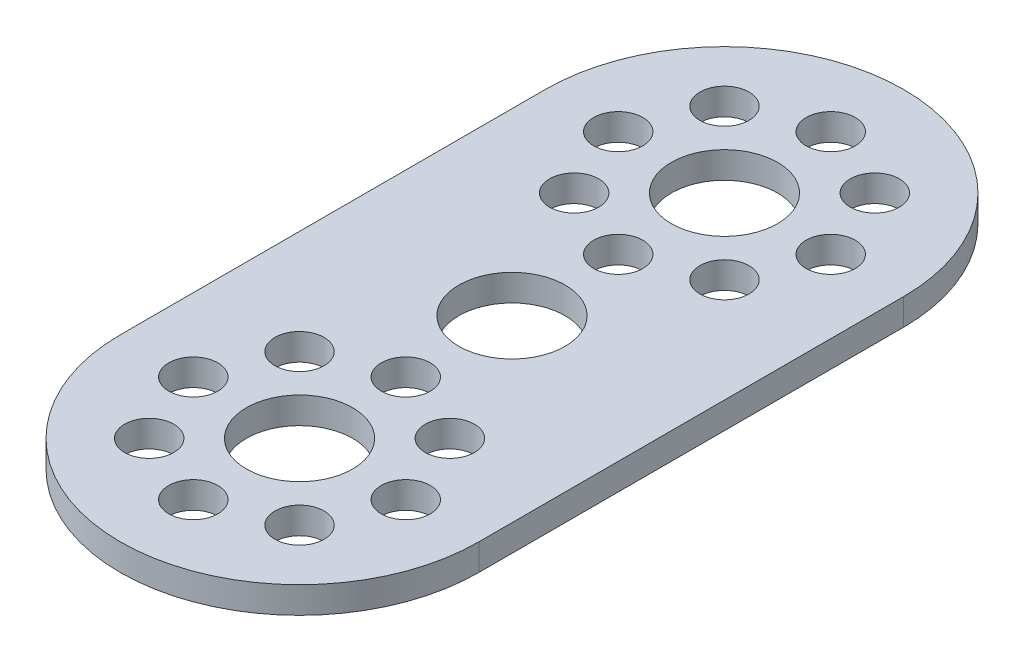
ISO-10303-21;
HEADER;
FILE_DESCRIPTION(('STEP AP214'),'2;1');
FILE_NAME('part.step','',(''),(''),'','','');
FILE_SCHEMA(('AUTOMOTIVE_DESIGN { 1 0 10303 214 1 1 1 1 }'));
ENDSEC;
DATA;
#1=APPLICATION_CONTEXT('core data for automotive mechanical design processes');
#2=APPLICATION_PROTOCOL_DEFINITION('international standard','automotive_design',2000,#1);
#3=PRODUCT_CONTEXT('',#1,'mechanical');
#4=PRODUCT('Part','Part','',(#3));
#5=PRODUCT_RELATED_PRODUCT_CATEGORY('part','',(#4));
#6=PRODUCT_DEFINITION_FORMATION('','',#4);
#7=PRODUCT_DEFINITION_CONTEXT('part definition',#1,'design');
#8=PRODUCT_DEFINITION('design','',#6,#7);
#9=PRODUCT_DEFINITION_SHAPE('','',#8);
#10=(LENGTH_UNIT() NAMED_UNIT(*) SI_UNIT(.MILLI.,.METRE.));
#11=(NAMED_UNIT(*) PLANE_ANGLE_UNIT() SI_UNIT($,.RADIAN.));
#12=(NAMED_UNIT(*) SI_UNIT($,.STERADIAN.) SOLID_ANGLE_UNIT());
#13=UNCERTAINTY_MEASURE_WITH_UNIT(LENGTH_MEASURE(1.E-05),#10,'distance_accuracy_value','');
#14=(GEOMETRIC_REPRESENTATION_CONTEXT(3) GLOBAL_UNCERTAINTY_ASSIGNED_CONTEXT((#13)) GLOBAL_UNIT_ASSIGNED_CONTEXT((#10,
#11,#12)) REPRESENTATION_CONTEXT('',''));
#15=CARTESIAN_POINT('',(0.,0.,0.));
#16=DIRECTION('',(0.,0.,1.));
#17=DIRECTION('',(1.,0.,0.));
#18=AXIS2_PLACEMENT_3D('',#15,#16,#17);
#19=CARTESIAN_POINT('',(0.,2.,16.));
#20=DIRECTION('',(0.,-1.,0.));
#21=DIRECTION('',(0.,0.,-1.));
#22=AXIS2_PLACEMENT_3D('',#19,#20,#21);
#23=CYLINDRICAL_SURFACE('',#22,13.5);
#24=CARTESIAN_POINT('',(0.,0.,16.));
#25=DIRECTION('',(0.,1.,0.));
#26=DIRECTION('',(0.,0.,1.));
#27=AXIS2_PLACEMENT_3D('',#24,#25,#26);
#28=CIRCLE('',#27,13.5);
#29=CARTESIAN_POINT('',(-13.5,0.,16.));
#30=VERTEX_POINT('',#29);
#31=CARTESIAN_POINT('',(13.5,0.,16.));
#32=VERTEX_POINT('',#31);
#33=EDGE_CURVE('E95',#30,#32,#28,.T.);
#34=ORIENTED_EDGE('',*,*,#33,.T.);
#35=DIRECTION('',(0.,-1.,0.));
#36=VECTOR('',#35,1.);
#37=CARTESIAN_POINT('',(13.5,2.,16.));
#38=LINE('',#37,#36);
#39=CARTESIAN_POINT('',(13.5,2.,16.));
#40=VERTEX_POINT('',#39);
#41=EDGE_CURVE('E11',#40,#32,#38,.T.);
#42=ORIENTED_EDGE('',*,*,#41,.F.);
#43=CARTESIAN_POINT('',(0.,2.,16.));
#44=DIRECTION('',(0.,1.,0.));
#45=DIRECTION('',(0.,0.,1.));
#46=AXIS2_PLACEMENT_3D('',#43,#44,#45);
#47=CIRCLE('',#46,13.5);
#48=CARTESIAN_POINT('',(-13.5,2.,16.));
#49=VERTEX_POINT('',#48);
#50=EDGE_CURVE('E83',#49,#40,#47,.T.);
#51=ORIENTED_EDGE('',*,*,#50,.F.);
#52=DIRECTION('',(0.,-1.,0.));
#53=VECTOR('',#52,1.);
#54=CARTESIAN_POINT('',(-13.5,2.,16.));
#55=LINE('',#54,#53);
#56=EDGE_CURVE('E91',#49,#30,#55,.T.);
#57=ORIENTED_EDGE('',*,*,#56,.T.);
#58=EDGE_LOOP('',(#34,#42,#51,#57));
#59=FACE_BOUND('',#58,.T.);
#60=ADVANCED_FACE('F32',(#59),#23,.T.);
#61=CARTESIAN_POINT('',(13.5,2.,-16.));
#62=DIRECTION('',(-1.,0.,0.));
#63=DIRECTION('',(0.,0.,1.));
#64=AXIS2_PLACEMENT_3D('',#61,#62,#63);
#65=PLANE('',#64);
#66=DIRECTION('',(0.,0.,-1.));
#67=VECTOR('',#66,1.);
#68=CARTESIAN_POINT('',(13.5,0.,-16.));
#69=LINE('',#68,#67);
#70=CARTESIAN_POINT('',(13.5,0.,-16.));
#71=VERTEX_POINT('',#70);
#72=EDGE_CURVE('E87',#32,#71,#69,.T.);
#73=ORIENTED_EDGE('',*,*,#72,.T.);
#74=DIRECTION('',(0.,-1.,0.));
#75=VECTOR('',#74,1.);
#76=CARTESIAN_POINT('',(13.5,2.,-16.));
#77=LINE('',#76,#75);
#78=CARTESIAN_POINT('',(13.5,2.,-16.));
#79=VERTEX_POINT('',#78);
#80=EDGE_CURVE('E40',#79,#71,#77,.T.);
#81=ORIENTED_EDGE('',*,*,#80,.F.);
#82=DIRECTION('',(0.,0.,-1.));
#83=VECTOR('',#82,1.);
#84=CARTESIAN_POINT('',(13.5,2.,-16.));
#85=LINE('',#84,#83);
#86=EDGE_CURVE('E78',#40,#79,#85,.T.);
#87=ORIENTED_EDGE('',*,*,#86,.F.);
#88=ORIENTED_EDGE('',*,*,#41,.T.);
#89=EDGE_LOOP('',(#73,#81,#87,#88));
#90=FACE_BOUND('',#89,.T.);
#91=ADVANCED_FACE('F86',(#90),#65,.F.);
#92=CARTESIAN_POINT('',(0.,2.,-16.));
#93=DIRECTION('',(0.,-1.,0.));
#94=DIRECTION('',(0.,0.,-1.));
#95=AXIS2_PLACEMENT_3D('',#92,#93,#94);
#96=CYLINDRICAL_SURFACE('',#95,13.5);
#97=CARTESIAN_POINT('',(0.,0.,-16.));
#98=DIRECTION('',(0.,1.,0.));
#99=DIRECTION('',(0.,0.,1.));
#100=AXIS2_PLACEMENT_3D('',#97,#98,#99);
#101=CIRCLE('',#100,13.5);
#102=CARTESIAN_POINT('',(-13.5,0.,-16.));
#103=VERTEX_POINT('',#102);
#104=EDGE_CURVE('E65',#71,#103,#101,.T.);
#105=ORIENTED_EDGE('',*,*,#104,.T.);
#106=DIRECTION('',(0.,-1.,0.));
#107=VECTOR('',#106,1.);
#108=CARTESIAN_POINT('',(-13.5,2.,-16.));
#109=LINE('',#108,#107);
#110=CARTESIAN_POINT('',(-13.5,2.,-16.));
#111=VERTEX_POINT('',#110);
#112=EDGE_CURVE('E88',#111,#103,#109,.T.);
#113=ORIENTED_EDGE('',*,*,#112,.F.);
#114=CARTESIAN_POINT('',(0.,2.,-16.));
#115=DIRECTION('',(0.,1.,0.));
#116=DIRECTION('',(0.,0.,1.));
#117=AXIS2_PLACEMENT_3D('',#114,#115,#116);
#118=CIRCLE('',#117,13.5);
#119=EDGE_CURVE('E81',#79,#111,#118,.T.);
#120=ORIENTED_EDGE('',*,*,#119,.F.);
#121=ORIENTED_EDGE('',*,*,#80,.T.);
#122=EDGE_LOOP('',(#105,#113,#120,#121));
#123=FACE_BOUND('',#122,.T.);
#124=ADVANCED_FACE('F89',(#123),#96,.T.);
#125=CARTESIAN_POINT('',(-13.5,2.,-16.));
#126=DIRECTION('',(1.,0.,0.));
#127=DIRECTION('',(0.,0.,-1.));
#128=AXIS2_PLACEMENT_3D('',#125,#126,#127);
#129=PLANE('',#128);
#130=DIRECTION('',(0.,0.,1.));
#131=VECTOR('',#130,1.);
#132=CARTESIAN_POINT('',(-13.5,0.,-16.));
#133=LINE('',#132,#131);
#134=EDGE_CURVE('E71',#103,#30,#133,.T.);
#135=ORIENTED_EDGE('',*,*,#134,.T.);
#136=ORIENTED_EDGE('',*,*,#56,.F.);
#137=DIRECTION('',(0.,0.,1.));
#138=VECTOR('',#137,1.);
#139=CARTESIAN_POINT('',(-13.5,2.,-16.));
#140=LINE('',#139,#138);
#141=EDGE_CURVE('E48',#111,#49,#140,.T.);
#142=ORIENTED_EDGE('',*,*,#141,.F.);
#143=ORIENTED_EDGE('',*,*,#112,.T.);
#144=EDGE_LOOP('',(#135,#136,#142,#143));
#145=FACE_BOUND('',#144,.T.);
#146=ADVANCED_FACE('F103',(#145),#129,.F.);
#147=CARTESIAN_POINT('',(0.,2.,16.));
#148=DIRECTION('',(0.,1.,0.));
#149=DIRECTION('',(0.,0.,1.));
#150=AXIS2_PLACEMENT_3D('',#147,#148,#149);
#151=PLANE('',#150);
#152=CARTESIAN_POINT('',(-5.66,2.,-10.34));
#153=DIRECTION('',(0.,1.,0.));
#154=DIRECTION('',(0.,0.,1.));
#155=AXIS2_PLACEMENT_3D('',#152,#153,#154);
#156=CIRCLE('',#155,1.84999999999998);
#157=CARTESIAN_POINT('',(-5.66,2.,-8.49000000000002));
#158=VERTEX_POINT('',#157);
#159=EDGE_CURVE('E217',#158,#158,#156,.T.);
#160=ORIENTED_EDGE('',*,*,#159,.F.);
#161=EDGE_LOOP('',(#160));
#162=FACE_BOUND('',#161,.T.);
#163=CARTESIAN_POINT('',(5.66,2.,-10.34));
#164=DIRECTION('',(0.,1.,0.));
#165=DIRECTION('',(0.,0.,1.));
#166=AXIS2_PLACEMENT_3D('',#163,#164,#165);
#167=CIRCLE('',#166,1.84999999999998);
#168=CARTESIAN_POINT('',(5.66,2.,-8.49000000000002));
#169=VERTEX_POINT('',#168);
#170=EDGE_CURVE('E211',#169,#169,#167,.T.);
#171=ORIENTED_EDGE('',*,*,#170,.F.);
#172=EDGE_LOOP('',(#171));
#173=FACE_BOUND('',#172,.T.);
#174=CARTESIAN_POINT('',(5.66,2.,-21.66));
#175=DIRECTION('',(0.,1.,0.));
#176=DIRECTION('',(0.,0.,1.));
#177=AXIS2_PLACEMENT_3D('',#174,#175,#176);
#178=CIRCLE('',#177,1.84999999999998);
#179=CARTESIAN_POINT('',(5.66,2.,-19.81));
#180=VERTEX_POINT('',#179);
#181=EDGE_CURVE('E205',#180,#180,#178,.T.);
#182=ORIENTED_EDGE('',*,*,#181,.F.);
#183=EDGE_LOOP('',(#182));
#184=FACE_BOUND('',#183,.T.);
#185=CARTESIAN_POINT('',(-5.66,2.,-21.66));
#186=DIRECTION('',(0.,1.,0.));
#187=DIRECTION('',(0.,0.,1.));
#188=AXIS2_PLACEMENT_3D('',#185,#186,#187);
#189=CIRCLE('',#188,1.84999999999998);
#190=CARTESIAN_POINT('',(-5.66,2.,-19.81));
#191=VERTEX_POINT('',#190);
#192=EDGE_CURVE('E199',#191,#191,#189,.T.);
#193=ORIENTED_EDGE('',*,*,#192,.F.);
#194=EDGE_LOOP('',(#193));
#195=FACE_BOUND('',#194,.T.);
#196=CARTESIAN_POINT('',(0.,2.,-24.));
#197=DIRECTION('',(0.,1.,0.));
#198=DIRECTION('',(0.,0.,1.));
#199=AXIS2_PLACEMENT_3D('',#196,#197,#198);
#200=CIRCLE('',#199,1.84999999999998);
#201=CARTESIAN_POINT('',(0.,2.,-22.15));
#202=VERTEX_POINT('',#201);
#203=EDGE_CURVE('E193',#202,#202,#200,.T.);
#204=ORIENTED_EDGE('',*,*,#203,.F.);
#205=EDGE_LOOP('',(#204));
#206=FACE_BOUND('',#205,.T.);
#207=CARTESIAN_POINT('',(0.,2.,-8.));
#208=DIRECTION('',(0.,1.,0.));
#209=DIRECTION('',(0.,0.,1.));
#210=AXIS2_PLACEMENT_3D('',#207,#208,#209);
#211=CIRCLE('',#210,1.84999999999998);
#212=CARTESIAN_POINT('',(0.,2.,-6.15000000000002));
#213=VERTEX_POINT('',#212);
#214=EDGE_CURVE('E187',#213,#213,#211,.T.);
#215=ORIENTED_EDGE('',*,*,#214,.F.);
#216=EDGE_LOOP('',(#215));
#217=FACE_BOUND('',#216,.T.);
#218=CARTESIAN_POINT('',(-8.00000000000001,2.,-16.));
#219=DIRECTION('',(0.,1.,0.));
#220=DIRECTION('',(0.,0.,1.));
#221=AXIS2_PLACEMENT_3D('',#218,#219,#220);
#222=CIRCLE('',#221,1.84999999999998);
#223=CARTESIAN_POINT('',(-8.00000000000001,2.,-14.15));
#224=VERTEX_POINT('',#223);
#225=EDGE_CURVE('E181',#224,#224,#222,.T.);
#226=ORIENTED_EDGE('',*,*,#225,.F.);
#227=EDGE_LOOP('',(#226));
#228=FACE_BOUND('',#227,.T.);
#229=CARTESIAN_POINT('',(8.00000000000001,2.,-16.));
#230=DIRECTION('',(0.,1.,0.));
#231=DIRECTION('',(0.,0.,1.));
#232=AXIS2_PLACEMENT_3D('',#229,#230,#231);
#233=CIRCLE('',#232,1.84999999999998);
#234=CARTESIAN_POINT('',(8.00000000000001,2.,-14.15));
#235=VERTEX_POINT('',#234);
#236=EDGE_CURVE('E175',#235,#235,#233,.T.);
#237=ORIENTED_EDGE('',*,*,#236,.F.);
#238=EDGE_LOOP('',(#237));
#239=FACE_BOUND('',#238,.T.);
#240=CARTESIAN_POINT('',(0.,2.,-16.));
#241=DIRECTION('',(0.,1.,0.));
#242=DIRECTION('',(0.,0.,1.));
#243=AXIS2_PLACEMENT_3D('',#240,#241,#242);
#244=CIRCLE('',#243,3.99999999999999);
#245=CARTESIAN_POINT('',(0.,2.,-12.));
#246=VERTEX_POINT('',#245);
#247=EDGE_CURVE('E169',#246,#246,#244,.T.);
#248=ORIENTED_EDGE('',*,*,#247,.F.);
#249=EDGE_LOOP('',(#248));
#250=FACE_BOUND('',#249,.T.);
#251=CARTESIAN_POINT('',(-5.66,2.,21.66));
#252=DIRECTION('',(0.,1.,0.));
#253=DIRECTION('',(0.,0.,1.));
#254=AXIS2_PLACEMENT_3D('',#251,#252,#253);
#255=CIRCLE('',#254,1.84999999999998);
#256=CARTESIAN_POINT('',(-5.66,2.,23.51));
#257=VERTEX_POINT('',#256);
#258=EDGE_CURVE('E163',#257,#257,#255,.T.);
#259=ORIENTED_EDGE('',*,*,#258,.F.);
#260=EDGE_LOOP('',(#259));
#261=FACE_BOUND('',#260,.T.);
#262=CARTESIAN_POINT('',(5.66,2.,21.66));
#263=DIRECTION('',(0.,1.,0.));
#264=DIRECTION('',(0.,0.,1.));
#265=AXIS2_PLACEMENT_3D('',#262,#263,#264);
#266=CIRCLE('',#265,1.84999999999998);
#267=CARTESIAN_POINT('',(5.66,2.,23.51));
#268=VERTEX_POINT('',#267);
#269=EDGE_CURVE('E157',#268,#268,#266,.T.);
#270=ORIENTED_EDGE('',*,*,#269,.F.);
#271=EDGE_LOOP('',(#270));
#272=FACE_BOUND('',#271,.T.);
#273=CARTESIAN_POINT('',(5.66,2.,10.34));
#274=DIRECTION('',(0.,1.,0.));
#275=DIRECTION('',(0.,0.,1.));
#276=AXIS2_PLACEMENT_3D('',#273,#274,#275);
#277=CIRCLE('',#276,1.84999999999998);
#278=CARTESIAN_POINT('',(5.66,2.,12.19));
#279=VERTEX_POINT('',#278);
#280=EDGE_CURVE('E151',#279,#279,#277,.T.);
#281=ORIENTED_EDGE('',*,*,#280,.F.);
#282=EDGE_LOOP('',(#281));
#283=FACE_BOUND('',#282,.T.);
#284=CARTESIAN_POINT('',(-5.66,2.,10.34));
#285=DIRECTION('',(0.,1.,0.));
#286=DIRECTION('',(0.,0.,1.));
#287=AXIS2_PLACEMENT_3D('',#284,#285,#286);
#288=CIRCLE('',#287,1.84999999999998);
#289=CARTESIAN_POINT('',(-5.66,2.,12.19));
#290=VERTEX_POINT('',#289);
#291=EDGE_CURVE('E145',#290,#290,#288,.T.);
#292=ORIENTED_EDGE('',*,*,#291,.F.);
#293=EDGE_LOOP('',(#292));
#294=FACE_BOUND('',#293,.T.);
#295=CARTESIAN_POINT('',(0.,2.,8.));
#296=DIRECTION('',(0.,1.,0.));
#297=DIRECTION('',(0.,0.,1.));
#298=AXIS2_PLACEMENT_3D('',#295,#296,#297);
#299=CIRCLE('',#298,1.84999999999998);
#300=CARTESIAN_POINT('',(0.,2.,9.84999999999998));
#301=VERTEX_POINT('',#300);
#302=EDGE_CURVE('E139',#301,#301,#299,.T.);
#303=ORIENTED_EDGE('',*,*,#302,.F.);
#304=EDGE_LOOP('',(#303));
#305=FACE_BOUND('',#304,.T.);
#306=CARTESIAN_POINT('',(0.,2.,24.));
#307=DIRECTION('',(0.,1.,0.));
#308=DIRECTION('',(0.,0.,1.));
#309=AXIS2_PLACEMENT_3D('',#306,#307,#308);
#310=CIRCLE('',#309,1.84999999999998);
#311=CARTESIAN_POINT('',(0.,2.,25.85));
#312=VERTEX_POINT('',#311);
#313=EDGE_CURVE('E133',#312,#312,#310,.T.);
#314=ORIENTED_EDGE('',*,*,#313,.F.);
#315=EDGE_LOOP('',(#314));
#316=FACE_BOUND('',#315,.T.);
#317=CARTESIAN_POINT('',(-8.00000000000001,2.,16.));
#318=DIRECTION('',(0.,1.,0.));
#319=DIRECTION('',(0.,0.,1.));
#320=AXIS2_PLACEMENT_3D('',#317,#318,#319);
#321=CIRCLE('',#320,1.84999999999998);
#322=CARTESIAN_POINT('',(-8.00000000000001,2.,17.85));
#323=VERTEX_POINT('',#322);
#324=EDGE_CURVE('E127',#323,#323,#321,.T.);
#325=ORIENTED_EDGE('',*,*,#324,.F.);
#326=EDGE_LOOP('',(#325));
#327=FACE_BOUND('',#326,.T.);
#328=CARTESIAN_POINT('',(8.00000000000001,2.,16.));
#329=DIRECTION('',(0.,1.,0.));
#330=DIRECTION('',(0.,0.,1.));
#331=AXIS2_PLACEMENT_3D('',#328,#329,#330);
#332=CIRCLE('',#331,1.84999999999998);
#333=CARTESIAN_POINT('',(8.00000000000001,2.,17.85));
#334=VERTEX_POINT('',#333);
#335=EDGE_CURVE('E121',#334,#334,#332,.T.);
#336=ORIENTED_EDGE('',*,*,#335,.F.);
#337=EDGE_LOOP('',(#336));
#338=FACE_BOUND('',#337,.T.);
#339=CARTESIAN_POINT('',(0.,2.,16.));
#340=DIRECTION('',(0.,1.,0.));
#341=DIRECTION('',(0.,0.,1.));
#342=AXIS2_PLACEMENT_3D('',#339,#340,#341);
#343=CIRCLE('',#342,3.99999999999999);
#344=CARTESIAN_POINT('',(0.,2.,20.));
#345=VERTEX_POINT('',#344);
#346=EDGE_CURVE('E115',#345,#345,#343,.T.);
#347=ORIENTED_EDGE('',*,*,#346,.F.);
#348=EDGE_LOOP('',(#347));
#349=FACE_BOUND('',#348,.T.);
#350=CARTESIAN_POINT('',(0.,2.,0.));
#351=DIRECTION('',(0.,1.,0.));
#352=DIRECTION('',(0.,0.,1.));
#353=AXIS2_PLACEMENT_3D('',#350,#351,#352);
#354=CIRCLE('',#353,4.);
#355=CARTESIAN_POINT('',(0.,2.,4.));
#356=VERTEX_POINT('',#355);
#357=EDGE_CURVE('E109',#356,#356,#354,.T.);
#358=ORIENTED_EDGE('',*,*,#357,.F.);
#359=EDGE_LOOP('',(#358));
#360=FACE_BOUND('',#359,.T.);
#361=ORIENTED_EDGE('',*,*,#50,.T.);
#362=ORIENTED_EDGE('',*,*,#86,.T.);
#363=ORIENTED_EDGE('',*,*,#119,.T.);
#364=ORIENTED_EDGE('',*,*,#141,.T.);
#365=EDGE_LOOP('',(#361,#362,#363,#364));
#366=FACE_BOUND('',#365,.T.);
#367=ADVANCED_FACE('F79',(#162,#173,#184,#195,#206,#217,#228,#239,#250,#261,#272,#283,#294,#305,
#316,#327,#338,#349,#360,#366),#151,.T.);
#368=CARTESIAN_POINT('',(0.,0.,16.));
#369=DIRECTION('',(0.,1.,0.));
#370=DIRECTION('',(0.,0.,1.));
#371=AXIS2_PLACEMENT_3D('',#368,#369,#370);
#372=PLANE('',#371);
#373=CARTESIAN_POINT('',(-5.66,0.,-10.34));
#374=DIRECTION('',(0.,1.,0.));
#375=DIRECTION('',(0.,0.,1.));
#376=AXIS2_PLACEMENT_3D('',#373,#374,#375);
#377=CIRCLE('',#376,1.84999999999998);
#378=CARTESIAN_POINT('',(-5.66,0.,-8.49000000000002));
#379=VERTEX_POINT('',#378);
#380=EDGE_CURVE('E214',#379,#379,#377,.T.);
#381=ORIENTED_EDGE('',*,*,#380,.T.);
#382=EDGE_LOOP('',(#381));
#383=FACE_BOUND('',#382,.T.);
#384=CARTESIAN_POINT('',(5.66,0.,-10.34));
#385=DIRECTION('',(0.,1.,0.));
#386=DIRECTION('',(0.,0.,1.));
#387=AXIS2_PLACEMENT_3D('',#384,#385,#386);
#388=CIRCLE('',#387,1.84999999999998);
#389=CARTESIAN_POINT('',(5.66,0.,-8.49000000000002));
#390=VERTEX_POINT('',#389);
#391=EDGE_CURVE('E208',#390,#390,#388,.T.);
#392=ORIENTED_EDGE('',*,*,#391,.T.);
#393=EDGE_LOOP('',(#392));
#394=FACE_BOUND('',#393,.T.);
#395=CARTESIAN_POINT('',(5.66,0.,-21.66));
#396=DIRECTION('',(0.,1.,0.));
#397=DIRECTION('',(0.,0.,1.));
#398=AXIS2_PLACEMENT_3D('',#395,#396,#397);
#399=CIRCLE('',#398,1.84999999999998);
#400=CARTESIAN_POINT('',(5.66,0.,-19.81));
#401=VERTEX_POINT('',#400);
#402=EDGE_CURVE('E202',#401,#401,#399,.T.);
#403=ORIENTED_EDGE('',*,*,#402,.T.);
#404=EDGE_LOOP('',(#403));
#405=FACE_BOUND('',#404,.T.);
#406=CARTESIAN_POINT('',(-5.66,0.,-21.66));
#407=DIRECTION('',(0.,1.,0.));
#408=DIRECTION('',(0.,0.,1.));
#409=AXIS2_PLACEMENT_3D('',#406,#407,#408);
#410=CIRCLE('',#409,1.84999999999998);
#411=CARTESIAN_POINT('',(-5.66,0.,-19.81));
#412=VERTEX_POINT('',#411);
#413=EDGE_CURVE('E196',#412,#412,#410,.T.);
#414=ORIENTED_EDGE('',*,*,#413,.T.);
#415=EDGE_LOOP('',(#414));
#416=FACE_BOUND('',#415,.T.);
#417=CARTESIAN_POINT('',(0.,0.,-24.));
#418=DIRECTION('',(0.,1.,0.));
#419=DIRECTION('',(0.,0.,1.));
#420=AXIS2_PLACEMENT_3D('',#417,#418,#419);
#421=CIRCLE('',#420,1.84999999999998);
#422=CARTESIAN_POINT('',(0.,0.,-22.15));
#423=VERTEX_POINT('',#422);
#424=EDGE_CURVE('E190',#423,#423,#421,.T.);
#425=ORIENTED_EDGE('',*,*,#424,.T.);
#426=EDGE_LOOP('',(#425));
#427=FACE_BOUND('',#426,.T.);
#428=CARTESIAN_POINT('',(0.,0.,-8.));
#429=DIRECTION('',(0.,1.,0.));
#430=DIRECTION('',(0.,0.,1.));
#431=AXIS2_PLACEMENT_3D('',#428,#429,#430);
#432=CIRCLE('',#431,1.84999999999998);
#433=CARTESIAN_POINT('',(0.,0.,-6.15000000000002));
#434=VERTEX_POINT('',#433);
#435=EDGE_CURVE('E184',#434,#434,#432,.T.);
#436=ORIENTED_EDGE('',*,*,#435,.T.);
#437=EDGE_LOOP('',(#436));
#438=FACE_BOUND('',#437,.T.);
#439=CARTESIAN_POINT('',(-8.00000000000001,0.,-16.));
#440=DIRECTION('',(0.,1.,0.));
#441=DIRECTION('',(0.,0.,1.));
#442=AXIS2_PLACEMENT_3D('',#439,#440,#441);
#443=CIRCLE('',#442,1.84999999999998);
#444=CARTESIAN_POINT('',(-8.00000000000001,0.,-14.15));
#445=VERTEX_POINT('',#444);
#446=EDGE_CURVE('E178',#445,#445,#443,.T.);
#447=ORIENTED_EDGE('',*,*,#446,.T.);
#448=EDGE_LOOP('',(#447));
#449=FACE_BOUND('',#448,.T.);
#450=CARTESIAN_POINT('',(8.00000000000001,0.,-16.));
#451=DIRECTION('',(0.,1.,0.));
#452=DIRECTION('',(0.,0.,1.));
#453=AXIS2_PLACEMENT_3D('',#450,#451,#452);
#454=CIRCLE('',#453,1.84999999999998);
#455=CARTESIAN_POINT('',(8.00000000000001,0.,-14.15));
#456=VERTEX_POINT('',#455);
#457=EDGE_CURVE('E172',#456,#456,#454,.T.);
#458=ORIENTED_EDGE('',*,*,#457,.T.);
#459=EDGE_LOOP('',(#458));
#460=FACE_BOUND('',#459,.T.);
#461=CARTESIAN_POINT('',(0.,0.,-16.));
#462=DIRECTION('',(0.,1.,0.));
#463=DIRECTION('',(0.,0.,1.));
#464=AXIS2_PLACEMENT_3D('',#461,#462,#463);
#465=CIRCLE('',#464,3.99999999999999);
#466=CARTESIAN_POINT('',(0.,0.,-12.));
#467=VERTEX_POINT('',#466);
#468=EDGE_CURVE('E166',#467,#467,#465,.T.);
#469=ORIENTED_EDGE('',*,*,#468,.T.);
#470=EDGE_LOOP('',(#469));
#471=FACE_BOUND('',#470,.T.);
#472=CARTESIAN_POINT('',(-5.66,0.,21.66));
#473=DIRECTION('',(0.,1.,0.));
#474=DIRECTION('',(0.,0.,1.));
#475=AXIS2_PLACEMENT_3D('',#472,#473,#474);
#476=CIRCLE('',#475,1.84999999999998);
#477=CARTESIAN_POINT('',(-5.66,0.,23.51));
#478=VERTEX_POINT('',#477);
#479=EDGE_CURVE('E160',#478,#478,#476,.T.);
#480=ORIENTED_EDGE('',*,*,#479,.T.);
#481=EDGE_LOOP('',(#480));
#482=FACE_BOUND('',#481,.T.);
#483=CARTESIAN_POINT('',(5.66,0.,21.66));
#484=DIRECTION('',(0.,1.,0.));
#485=DIRECTION('',(0.,0.,1.));
#486=AXIS2_PLACEMENT_3D('',#483,#484,#485);
#487=CIRCLE('',#486,1.84999999999998);
#488=CARTESIAN_POINT('',(5.66,0.,23.51));
#489=VERTEX_POINT('',#488);
#490=EDGE_CURVE('E154',#489,#489,#487,.T.);
#491=ORIENTED_EDGE('',*,*,#490,.T.);
#492=EDGE_LOOP('',(#491));
#493=FACE_BOUND('',#492,.T.);
#494=CARTESIAN_POINT('',(5.66,0.,10.34));
#495=DIRECTION('',(0.,1.,0.));
#496=DIRECTION('',(0.,0.,1.));
#497=AXIS2_PLACEMENT_3D('',#494,#495,#496);
#498=CIRCLE('',#497,1.84999999999998);
#499=CARTESIAN_POINT('',(5.66,0.,12.19));
#500=VERTEX_POINT('',#499);
#501=EDGE_CURVE('E148',#500,#500,#498,.T.);
#502=ORIENTED_EDGE('',*,*,#501,.T.);
#503=EDGE_LOOP('',(#502));
#504=FACE_BOUND('',#503,.T.);
#505=CARTESIAN_POINT('',(-5.66,0.,10.34));
#506=DIRECTION('',(0.,1.,0.));
#507=DIRECTION('',(0.,0.,1.));
#508=AXIS2_PLACEMENT_3D('',#505,#506,#507);
#509=CIRCLE('',#508,1.84999999999998);
#510=CARTESIAN_POINT('',(-5.66,0.,12.19));
#511=VERTEX_POINT('',#510);
#512=EDGE_CURVE('E142',#511,#511,#509,.T.);
#513=ORIENTED_EDGE('',*,*,#512,.T.);
#514=EDGE_LOOP('',(#513));
#515=FACE_BOUND('',#514,.T.);
#516=CARTESIAN_POINT('',(0.,0.,8.));
#517=DIRECTION('',(0.,1.,0.));
#518=DIRECTION('',(0.,0.,1.));
#519=AXIS2_PLACEMENT_3D('',#516,#517,#518);
#520=CIRCLE('',#519,1.84999999999998);
#521=CARTESIAN_POINT('',(0.,0.,9.84999999999998));
#522=VERTEX_POINT('',#521);
#523=EDGE_CURVE('E136',#522,#522,#520,.T.);
#524=ORIENTED_EDGE('',*,*,#523,.T.);
#525=EDGE_LOOP('',(#524));
#526=FACE_BOUND('',#525,.T.);
#527=CARTESIAN_POINT('',(0.,0.,24.));
#528=DIRECTION('',(0.,1.,0.));
#529=DIRECTION('',(0.,0.,1.));
#530=AXIS2_PLACEMENT_3D('',#527,#528,#529);
#531=CIRCLE('',#530,1.84999999999998);
#532=CARTESIAN_POINT('',(0.,0.,25.85));
#533=VERTEX_POINT('',#532);
#534=EDGE_CURVE('E130',#533,#533,#531,.T.);
#535=ORIENTED_EDGE('',*,*,#534,.T.);
#536=EDGE_LOOP('',(#535));
#537=FACE_BOUND('',#536,.T.);
#538=CARTESIAN_POINT('',(-8.00000000000001,0.,16.));
#539=DIRECTION('',(0.,1.,0.));
#540=DIRECTION('',(0.,0.,1.));
#541=AXIS2_PLACEMENT_3D('',#538,#539,#540);
#542=CIRCLE('',#541,1.84999999999998);
#543=CARTESIAN_POINT('',(-8.00000000000001,0.,17.85));
#544=VERTEX_POINT('',#543);
#545=EDGE_CURVE('E124',#544,#544,#542,.T.);
#546=ORIENTED_EDGE('',*,*,#545,.T.);
#547=EDGE_LOOP('',(#546));
#548=FACE_BOUND('',#547,.T.);
#549=CARTESIAN_POINT('',(8.00000000000001,0.,16.));
#550=DIRECTION('',(0.,1.,0.));
#551=DIRECTION('',(0.,0.,1.));
#552=AXIS2_PLACEMENT_3D('',#549,#550,#551);
#553=CIRCLE('',#552,1.84999999999998);
#554=CARTESIAN_POINT('',(8.00000000000001,0.,17.85));
#555=VERTEX_POINT('',#554);
#556=EDGE_CURVE('E118',#555,#555,#553,.T.);
#557=ORIENTED_EDGE('',*,*,#556,.T.);
#558=EDGE_LOOP('',(#557));
#559=FACE_BOUND('',#558,.T.);
#560=CARTESIAN_POINT('',(0.,0.,16.));
#561=DIRECTION('',(0.,1.,0.));
#562=DIRECTION('',(0.,0.,1.));
#563=AXIS2_PLACEMENT_3D('',#560,#561,#562);
#564=CIRCLE('',#563,3.99999999999999);
#565=CARTESIAN_POINT('',(0.,0.,20.));
#566=VERTEX_POINT('',#565);
#567=EDGE_CURVE('E112',#566,#566,#564,.T.);
#568=ORIENTED_EDGE('',*,*,#567,.T.);
#569=EDGE_LOOP('',(#568));
#570=FACE_BOUND('',#569,.T.);
#571=CARTESIAN_POINT('',(0.,0.,0.));
#572=DIRECTION('',(0.,1.,0.));
#573=DIRECTION('',(0.,0.,1.));
#574=AXIS2_PLACEMENT_3D('',#571,#572,#573);
#575=CIRCLE('',#574,4.);
#576=CARTESIAN_POINT('',(0.,0.,4.));
#577=VERTEX_POINT('',#576);
#578=EDGE_CURVE('E98',#577,#577,#575,.T.);
#579=ORIENTED_EDGE('',*,*,#578,.T.);
#580=EDGE_LOOP('',(#579));
#581=FACE_BOUND('',#580,.T.);
#582=ORIENTED_EDGE('',*,*,#33,.F.);
#583=ORIENTED_EDGE('',*,*,#134,.F.);
#584=ORIENTED_EDGE('',*,*,#104,.F.);
#585=ORIENTED_EDGE('',*,*,#72,.F.);
#586=EDGE_LOOP('',(#582,#583,#584,#585));
#587=FACE_BOUND('',#586,.T.);
#588=ADVANCED_FACE('F106',(#383,#394,#405,#416,#427,#438,#449,#460,#471,#482,#493,#504,#515,
#526,#537,#548,#559,#570,#581,#587),#372,.F.);
#589=CARTESIAN_POINT('',(0.,0.,0.));
#590=DIRECTION('',(0.,1.,0.));
#591=DIRECTION('',(0.,0.,1.));
#592=AXIS2_PLACEMENT_3D('',#589,#590,#591);
#593=CYLINDRICAL_SURFACE('',#592,4.);
#594=ORIENTED_EDGE('',*,*,#578,.F.);
#595=EDGE_LOOP('',(#594));
#596=FACE_BOUND('',#595,.T.);
#597=ORIENTED_EDGE('',*,*,#357,.T.);
#598=EDGE_LOOP('',(#597));
#599=FACE_BOUND('',#598,.T.);
#600=ADVANCED_FACE('F271',(#596,#599),#593,.F.);
#601=CARTESIAN_POINT('',(0.,0.,16.));
#602=DIRECTION('',(0.,1.,0.));
#603=DIRECTION('',(0.,0.,1.));
#604=AXIS2_PLACEMENT_3D('',#601,#602,#603);
#605=CYLINDRICAL_SURFACE('',#604,3.99999999999999);
#606=ORIENTED_EDGE('',*,*,#567,.F.);
#607=EDGE_LOOP('',(#606));
#608=FACE_BOUND('',#607,.T.);
#609=ORIENTED_EDGE('',*,*,#346,.T.);
#610=EDGE_LOOP('',(#609));
#611=FACE_BOUND('',#610,.T.);
#612=ADVANCED_FACE('F273',(#608,#611),#605,.F.);
#613=CARTESIAN_POINT('',(8.00000000000001,0.,16.));
#614=DIRECTION('',(0.,1.,0.));
#615=DIRECTION('',(0.,0.,1.));
#616=AXIS2_PLACEMENT_3D('',#613,#614,#615);
#617=CYLINDRICAL_SURFACE('',#616,1.84999999999998);
#618=ORIENTED_EDGE('',*,*,#556,.F.);
#619=EDGE_LOOP('',(#618));
#620=FACE_BOUND('',#619,.T.);
#621=ORIENTED_EDGE('',*,*,#335,.T.);
#622=EDGE_LOOP('',(#621));
#623=FACE_BOUND('',#622,.T.);
#624=ADVANCED_FACE('F280',(#620,#623),#617,.F.);
#625=CARTESIAN_POINT('',(-8.00000000000001,0.,16.));
#626=DIRECTION('',(0.,1.,0.));
#627=DIRECTION('',(0.,0.,1.));
#628=AXIS2_PLACEMENT_3D('',#625,#626,#627);
#629=CYLINDRICAL_SURFACE('',#628,1.84999999999998);
#630=ORIENTED_EDGE('',*,*,#545,.F.);
#631=EDGE_LOOP('',(#630));
#632=FACE_BOUND('',#631,.T.);
#633=ORIENTED_EDGE('',*,*,#324,.T.);
#634=EDGE_LOOP('',(#633));
#635=FACE_BOUND('',#634,.T.);
#636=ADVANCED_FACE('F326',(#632,#635),#629,.F.);
#637=CARTESIAN_POINT('',(0.,0.,24.));
#638=DIRECTION('',(0.,1.,0.));
#639=DIRECTION('',(0.,0.,1.));
#640=AXIS2_PLACEMENT_3D('',#637,#638,#639);
#641=CYLINDRICAL_SURFACE('',#640,1.84999999999998);
#642=ORIENTED_EDGE('',*,*,#534,.F.);
#643=EDGE_LOOP('',(#642));
#644=FACE_BOUND('',#643,.T.);
#645=ORIENTED_EDGE('',*,*,#313,.T.);
#646=EDGE_LOOP('',(#645));
#647=FACE_BOUND('',#646,.T.);
#648=ADVANCED_FACE('F336',(#644,#647),#641,.F.);
#649=CARTESIAN_POINT('',(0.,0.,8.));
#650=DIRECTION('',(0.,1.,0.));
#651=DIRECTION('',(0.,0.,1.));
#652=AXIS2_PLACEMENT_3D('',#649,#650,#651);
#653=CYLINDRICAL_SURFACE('',#652,1.84999999999998);
#654=ORIENTED_EDGE('',*,*,#523,.F.);
#655=EDGE_LOOP('',(#654));
#656=FACE_BOUND('',#655,.T.);
#657=ORIENTED_EDGE('',*,*,#302,.T.);
#658=EDGE_LOOP('',(#657));
#659=FACE_BOUND('',#658,.T.);
#660=ADVANCED_FACE('F346',(#656,#659),#653,.F.);
#661=CARTESIAN_POINT('',(-5.66,0.,10.34));
#662=DIRECTION('',(0.,1.,0.));
#663=DIRECTION('',(0.,0.,1.));
#664=AXIS2_PLACEMENT_3D('',#661,#662,#663);
#665=CYLINDRICAL_SURFACE('',#664,1.84999999999998);
#666=ORIENTED_EDGE('',*,*,#512,.F.);
#667=EDGE_LOOP('',(#666));
#668=FACE_BOUND('',#667,.T.);
#669=ORIENTED_EDGE('',*,*,#291,.T.);
#670=EDGE_LOOP('',(#669));
#671=FACE_BOUND('',#670,.T.);
#672=ADVANCED_FACE('F356',(#668,#671),#665,.F.);
#673=CARTESIAN_POINT('',(5.66,0.,10.34));
#674=DIRECTION('',(0.,1.,0.));
#675=DIRECTION('',(0.,0.,1.));
#676=AXIS2_PLACEMENT_3D('',#673,#674,#675);
#677=CYLINDRICAL_SURFACE('',#676,1.84999999999998);
#678=ORIENTED_EDGE('',*,*,#501,.F.);
#679=EDGE_LOOP('',(#678));
#680=FACE_BOUND('',#679,.T.);
#681=ORIENTED_EDGE('',*,*,#280,.T.);
#682=EDGE_LOOP('',(#681));
#683=FACE_BOUND('',#682,.T.);
#684=ADVANCED_FACE('F366',(#680,#683),#677,.F.);
#685=CARTESIAN_POINT('',(5.66,0.,21.66));
#686=DIRECTION('',(0.,1.,0.));
#687=DIRECTION('',(0.,0.,1.));
#688=AXIS2_PLACEMENT_3D('',#685,#686,#687);
#689=CYLINDRICAL_SURFACE('',#688,1.84999999999998);
#690=ORIENTED_EDGE('',*,*,#490,.F.);
#691=EDGE_LOOP('',(#690));
#692=FACE_BOUND('',#691,.T.);
#693=ORIENTED_EDGE('',*,*,#269,.T.);
#694=EDGE_LOOP('',(#693));
#695=FACE_BOUND('',#694,.T.);
#696=ADVANCED_FACE('F376',(#692,#695),#689,.F.);
#697=CARTESIAN_POINT('',(-5.66,0.,21.66));
#698=DIRECTION('',(0.,1.,0.));
#699=DIRECTION('',(0.,0.,1.));
#700=AXIS2_PLACEMENT_3D('',#697,#698,#699);
#701=CYLINDRICAL_SURFACE('',#700,1.84999999999998);
#702=ORIENTED_EDGE('',*,*,#479,.F.);
#703=EDGE_LOOP('',(#702));
#704=FACE_BOUND('',#703,.T.);
#705=ORIENTED_EDGE('',*,*,#258,.T.);
#706=EDGE_LOOP('',(#705));
#707=FACE_BOUND('',#706,.T.);
#708=ADVANCED_FACE('F386',(#704,#707),#701,.F.);
#709=CARTESIAN_POINT('',(0.,0.,-16.));
#710=DIRECTION('',(0.,1.,0.));
#711=DIRECTION('',(0.,0.,1.));
#712=AXIS2_PLACEMENT_3D('',#709,#710,#711);
#713=CYLINDRICAL_SURFACE('',#712,3.99999999999999);
#714=ORIENTED_EDGE('',*,*,#468,.F.);
#715=EDGE_LOOP('',(#714));
#716=FACE_BOUND('',#715,.T.);
#717=ORIENTED_EDGE('',*,*,#247,.T.);
#718=EDGE_LOOP('',(#717));
#719=FACE_BOUND('',#718,.T.);
#720=ADVANCED_FACE('F396',(#716,#719),#713,.F.);
#721=CARTESIAN_POINT('',(8.00000000000001,0.,-16.));
#722=DIRECTION('',(0.,1.,0.));
#723=DIRECTION('',(0.,0.,1.));
#724=AXIS2_PLACEMENT_3D('',#721,#722,#723);
#725=CYLINDRICAL_SURFACE('',#724,1.84999999999998);
#726=ORIENTED_EDGE('',*,*,#457,.F.);
#727=EDGE_LOOP('',(#726));
#728=FACE_BOUND('',#727,.T.);
#729=ORIENTED_EDGE('',*,*,#236,.T.);
#730=EDGE_LOOP('',(#729));
#731=FACE_BOUND('',#730,.T.);
#732=ADVANCED_FACE('F406',(#728,#731),#725,.F.);
#733=CARTESIAN_POINT('',(-8.00000000000001,0.,-16.));
#734=DIRECTION('',(0.,1.,0.));
#735=DIRECTION('',(0.,0.,1.));
#736=AXIS2_PLACEMENT_3D('',#733,#734,#735);
#737=CYLINDRICAL_SURFACE('',#736,1.84999999999998);
#738=ORIENTED_EDGE('',*,*,#446,.F.);
#739=EDGE_LOOP('',(#738));
#740=FACE_BOUND('',#739,.T.);
#741=ORIENTED_EDGE('',*,*,#225,.T.);
#742=EDGE_LOOP('',(#741));
#743=FACE_BOUND('',#742,.T.);
#744=ADVANCED_FACE('F416',(#740,#743),#737,.F.);
#745=CARTESIAN_POINT('',(0.,0.,-8.));
#746=DIRECTION('',(0.,1.,0.));
#747=DIRECTION('',(0.,0.,1.));
#748=AXIS2_PLACEMENT_3D('',#745,#746,#747);
#749=CYLINDRICAL_SURFACE('',#748,1.84999999999998);
#750=ORIENTED_EDGE('',*,*,#435,.F.);
#751=EDGE_LOOP('',(#750));
#752=FACE_BOUND('',#751,.T.);
#753=ORIENTED_EDGE('',*,*,#214,.T.);
#754=EDGE_LOOP('',(#753));
#755=FACE_BOUND('',#754,.T.);
#756=ADVANCED_FACE('F426',(#752,#755),#749,.F.);
#757=CARTESIAN_POINT('',(0.,0.,-24.));
#758=DIRECTION('',(0.,1.,0.));
#759=DIRECTION('',(0.,0.,1.));
#760=AXIS2_PLACEMENT_3D('',#757,#758,#759);
#761=CYLINDRICAL_SURFACE('',#760,1.84999999999998);
#762=ORIENTED_EDGE('',*,*,#424,.F.);
#763=EDGE_LOOP('',(#762));
#764=FACE_BOUND('',#763,.T.);
#765=ORIENTED_EDGE('',*,*,#203,.T.);
#766=EDGE_LOOP('',(#765));
#767=FACE_BOUND('',#766,.T.);
#768=ADVANCED_FACE('F436',(#764,#767),#761,.F.);
#769=CARTESIAN_POINT('',(-5.66,0.,-21.66));
#770=DIRECTION('',(0.,1.,0.));
#771=DIRECTION('',(0.,0.,1.));
#772=AXIS2_PLACEMENT_3D('',#769,#770,#771);
#773=CYLINDRICAL_SURFACE('',#772,1.84999999999998);
#774=ORIENTED_EDGE('',*,*,#413,.F.);
#775=EDGE_LOOP('',(#774));
#776=FACE_BOUND('',#775,.T.);
#777=ORIENTED_EDGE('',*,*,#192,.T.);
#778=EDGE_LOOP('',(#777));
#779=FACE_BOUND('',#778,.T.);
#780=ADVANCED_FACE('F446',(#776,#779),#773,.F.);
#781=CARTESIAN_POINT('',(5.66,0.,-21.66));
#782=DIRECTION('',(0.,1.,0.));
#783=DIRECTION('',(0.,0.,1.));
#784=AXIS2_PLACEMENT_3D('',#781,#782,#783);
#785=CYLINDRICAL_SURFACE('',#784,1.84999999999998);
#786=ORIENTED_EDGE('',*,*,#402,.F.);
#787=EDGE_LOOP('',(#786));
#788=FACE_BOUND('',#787,.T.);
#789=ORIENTED_EDGE('',*,*,#181,.T.);
#790=EDGE_LOOP('',(#789));
#791=FACE_BOUND('',#790,.T.);
#792=ADVANCED_FACE('F456',(#788,#791),#785,.F.);
#793=CARTESIAN_POINT('',(5.66,0.,-10.34));
#794=DIRECTION('',(0.,1.,0.));
#795=DIRECTION('',(0.,0.,1.));
#796=AXIS2_PLACEMENT_3D('',#793,#794,#795);
#797=CYLINDRICAL_SURFACE('',#796,1.84999999999998);
#798=ORIENTED_EDGE('',*,*,#391,.F.);
#799=EDGE_LOOP('',(#798));
#800=FACE_BOUND('',#799,.T.);
#801=ORIENTED_EDGE('',*,*,#170,.T.);
#802=EDGE_LOOP('',(#801));
#803=FACE_BOUND('',#802,.T.);
#804=ADVANCED_FACE('F228',(#800,#803),#797,.F.);
#805=CARTESIAN_POINT('',(-5.66,0.,-10.34));
#806=DIRECTION('',(0.,1.,0.));
#807=DIRECTION('',(0.,0.,1.));
#808=AXIS2_PLACEMENT_3D('',#805,#806,#807);
#809=CYLINDRICAL_SURFACE('',#808,1.84999999999998);
#810=ORIENTED_EDGE('',*,*,#380,.F.);
#811=EDGE_LOOP('',(#810));
#812=FACE_BOUND('',#811,.T.);
#813=ORIENTED_EDGE('',*,*,#159,.T.);
#814=EDGE_LOOP('',(#813));
#815=FACE_BOUND('',#814,.T.);
#816=ADVANCED_FACE('F225',(#812,#815),#809,.F.);
#817=CLOSED_SHELL('',(#60,#91,#124,#146,#367,#588,#600,#612,#624,#636,#648,#660,#672,#684,#696,
#708,#720,#732,#744,#756,#768,#780,#792,#804,#816));
#818=MANIFOLD_SOLID_BREP('B2',#817);
#819=ADVANCED_BREP_SHAPE_REPRESENTATION('',(#18,#818),#14);
#820=SHAPE_DEFINITION_REPRESENTATION(#9,#819);
ENDSEC;
END-ISO-10303-21;
